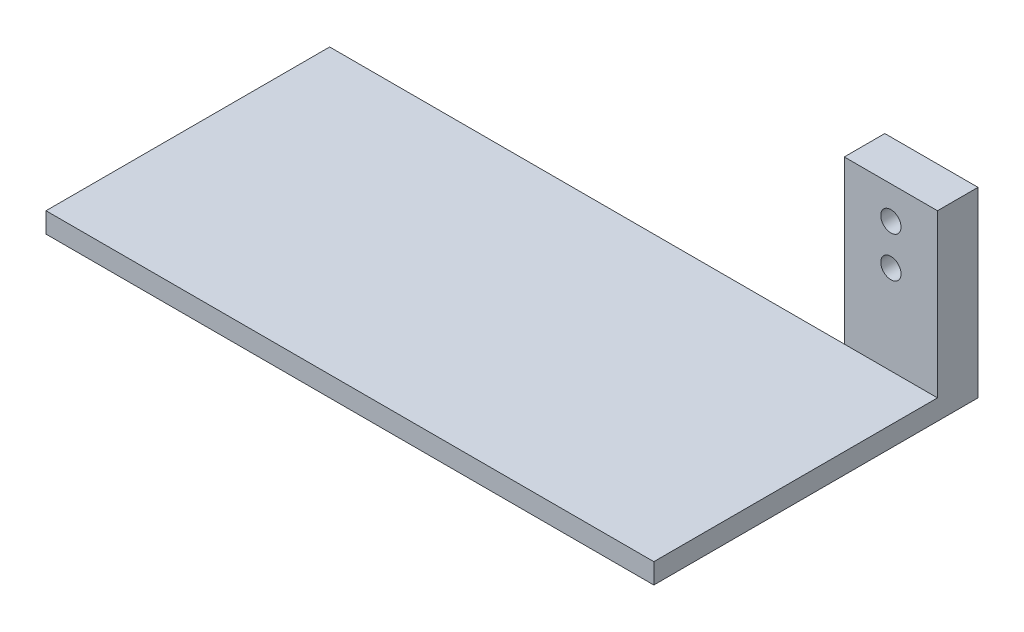
ISO-10303-21;
HEADER;
FILE_DESCRIPTION(('STEP AP214'),'2;1');
FILE_NAME('part.step','',(''),(''),'','','');
FILE_SCHEMA(('AUTOMOTIVE_DESIGN { 1 0 10303 214 1 1 1 1 }'));
ENDSEC;
DATA;
#1=APPLICATION_CONTEXT('core data for automotive mechanical design processes');
#2=APPLICATION_PROTOCOL_DEFINITION('international standard','automotive_design',2000,#1);
#3=PRODUCT_CONTEXT('',#1,'mechanical');
#4=PRODUCT('Part','Part','',(#3));
#5=PRODUCT_RELATED_PRODUCT_CATEGORY('part','',(#4));
#6=PRODUCT_DEFINITION_FORMATION('','',#4);
#7=PRODUCT_DEFINITION_CONTEXT('part definition',#1,'design');
#8=PRODUCT_DEFINITION('design','',#6,#7);
#9=PRODUCT_DEFINITION_SHAPE('','',#8);
#10=(LENGTH_UNIT() NAMED_UNIT(*) SI_UNIT(.MILLI.,.METRE.));
#11=(NAMED_UNIT(*) PLANE_ANGLE_UNIT() SI_UNIT($,.RADIAN.));
#12=(NAMED_UNIT(*) SI_UNIT($,.STERADIAN.) SOLID_ANGLE_UNIT());
#13=UNCERTAINTY_MEASURE_WITH_UNIT(LENGTH_MEASURE(1.E-05),#10,'distance_accuracy_value','');
#14=(GEOMETRIC_REPRESENTATION_CONTEXT(3) GLOBAL_UNCERTAINTY_ASSIGNED_CONTEXT((#13)) GLOBAL_UNIT_ASSIGNED_CONTEXT((#10,
#11,#12)) REPRESENTATION_CONTEXT('',''));
#15=CARTESIAN_POINT('',(0.,0.,0.));
#16=DIRECTION('',(0.,0.,1.));
#17=DIRECTION('',(1.,0.,0.));
#18=AXIS2_PLACEMENT_3D('',#15,#16,#17);
#19=CARTESIAN_POINT('',(-11.5,40.,5.));
#20=DIRECTION('',(0.,0.,-1.));
#21=DIRECTION('',(-1.,0.,0.));
#22=AXIS2_PLACEMENT_3D('',#19,#20,#21);
#23=PLANE('',#22);
#24=CARTESIAN_POINT('',(0.,22.,5.));
#25=DIRECTION('',(0.,0.,1.));
#26=DIRECTION('',(1.,0.,0.));
#27=AXIS2_PLACEMENT_3D('',#24,#25,#26);
#28=CIRCLE('',#27,2.5);
#29=CARTESIAN_POINT('',(2.5,22.,5.));
#30=VERTEX_POINT('',#29);
#31=EDGE_CURVE('E130',#30,#30,#28,.T.);
#32=ORIENTED_EDGE('',*,*,#31,.F.);
#33=EDGE_LOOP('',(#32));
#34=FACE_BOUND('',#33,.T.);
#35=CARTESIAN_POINT('',(0.,32.,5.));
#36=DIRECTION('',(0.,0.,1.));
#37=DIRECTION('',(1.,0.,0.));
#38=AXIS2_PLACEMENT_3D('',#35,#36,#37);
#39=CIRCLE('',#38,2.5);
#40=CARTESIAN_POINT('',(2.5,32.,5.));
#41=VERTEX_POINT('',#40);
#42=EDGE_CURVE('E135',#41,#41,#39,.T.);
#43=ORIENTED_EDGE('',*,*,#42,.F.);
#44=EDGE_LOOP('',(#43));
#45=FACE_BOUND('',#44,.T.);
#46=DIRECTION('',(-1.,0.,0.));
#47=VECTOR('',#46,1.);
#48=CARTESIAN_POINT('',(-138.5,0.,5.));
#49=LINE('',#48,#47);
#50=CARTESIAN_POINT('',(11.5,0.,5.));
#51=VERTEX_POINT('',#50);
#52=CARTESIAN_POINT('',(-11.5,0.,5.));
#53=VERTEX_POINT('',#52);
#54=EDGE_CURVE('E47',#51,#53,#49,.T.);
#55=ORIENTED_EDGE('',*,*,#54,.F.);
#56=DIRECTION('',(0.,-1.,0.));
#57=VECTOR('',#56,1.);
#58=CARTESIAN_POINT('',(11.5,40.,5.));
#59=LINE('',#58,#57);
#60=CARTESIAN_POINT('',(11.5,40.,5.));
#61=VERTEX_POINT('',#60);
#62=EDGE_CURVE('E116',#61,#51,#59,.T.);
#63=ORIENTED_EDGE('',*,*,#62,.F.);
#64=DIRECTION('',(1.,0.,0.));
#65=VECTOR('',#64,1.);
#66=CARTESIAN_POINT('',(-11.5,40.,5.));
#67=LINE('',#66,#65);
#68=CARTESIAN_POINT('',(-11.5,40.,5.));
#69=VERTEX_POINT('',#68);
#70=EDGE_CURVE('E55',#69,#61,#67,.T.);
#71=ORIENTED_EDGE('',*,*,#70,.F.);
#72=DIRECTION('',(0.,-1.,0.));
#73=VECTOR('',#72,1.);
#74=CARTESIAN_POINT('',(-11.5,40.,5.));
#75=LINE('',#74,#73);
#76=EDGE_CURVE('E151',#69,#53,#75,.T.);
#77=ORIENTED_EDGE('',*,*,#76,.T.);
#78=EDGE_LOOP('',(#55,#63,#71,#77));
#79=FACE_BOUND('',#78,.T.);
#80=ADVANCED_FACE('F32',(#34,#45,#79),#23,.F.);
#81=CARTESIAN_POINT('',(11.5,40.,-5.));
#82=DIRECTION('',(-1.,0.,0.));
#83=DIRECTION('',(0.,0.,1.));
#84=AXIS2_PLACEMENT_3D('',#81,#82,#83);
#85=PLANE('',#84);
#86=ORIENTED_EDGE('',*,*,#62,.T.);
#87=DIRECTION('',(0.,0.,-1.));
#88=VECTOR('',#87,1.);
#89=CARTESIAN_POINT('',(11.5,0.,75.));
#90=LINE('',#89,#88);
#91=CARTESIAN_POINT('',(11.5,0.,75.));
#92=VERTEX_POINT('',#91);
#93=EDGE_CURVE('E98',#92,#51,#90,.T.);
#94=ORIENTED_EDGE('',*,*,#93,.F.);
#95=DIRECTION('',(0.,1.,0.));
#96=VECTOR('',#95,1.);
#97=CARTESIAN_POINT('',(11.5,0.,75.));
#98=LINE('',#97,#96);
#99=CARTESIAN_POINT('',(11.5,-5.,75.));
#100=VERTEX_POINT('',#99);
#101=EDGE_CURVE('E104',#100,#92,#98,.T.);
#102=ORIENTED_EDGE('',*,*,#101,.F.);
#103=DIRECTION('',(0.,0.,1.));
#104=VECTOR('',#103,1.);
#105=CARTESIAN_POINT('',(11.5,-5.,-5.));
#106=LINE('',#105,#104);
#107=CARTESIAN_POINT('',(11.5,-5.,-5.));
#108=VERTEX_POINT('',#107);
#109=EDGE_CURVE('E120',#108,#100,#106,.T.);
#110=ORIENTED_EDGE('',*,*,#109,.F.);
#111=DIRECTION('',(0.,-1.,0.));
#112=VECTOR('',#111,1.);
#113=CARTESIAN_POINT('',(11.5,40.,-5.));
#114=LINE('',#113,#112);
#115=CARTESIAN_POINT('',(11.5,40.,-5.));
#116=VERTEX_POINT('',#115);
#117=EDGE_CURVE('E11',#116,#108,#114,.T.);
#118=ORIENTED_EDGE('',*,*,#117,.F.);
#119=DIRECTION('',(0.,0.,-1.));
#120=VECTOR('',#119,1.);
#121=CARTESIAN_POINT('',(11.5,40.,-5.));
#122=LINE('',#121,#120);
#123=EDGE_CURVE('E134',#61,#116,#122,.T.);
#124=ORIENTED_EDGE('',*,*,#123,.F.);
#125=EDGE_LOOP('',(#86,#94,#102,#110,#118,#124));
#126=FACE_BOUND('',#125,.T.);
#127=ADVANCED_FACE('F34',(#126),#85,.F.);
#128=CARTESIAN_POINT('',(-11.5,40.,-5.));
#129=DIRECTION('',(0.,0.,1.));
#130=DIRECTION('',(1.,0.,0.));
#131=AXIS2_PLACEMENT_3D('',#128,#129,#130);
#132=PLANE('',#131);
#133=CARTESIAN_POINT('',(0.,32.,-5.));
#134=DIRECTION('',(0.,0.,1.));
#135=DIRECTION('',(1.,0.,0.));
#136=AXIS2_PLACEMENT_3D('',#133,#134,#135);
#137=CIRCLE('',#136,2.5);
#138=CARTESIAN_POINT('',(2.5,32.,-5.));
#139=VERTEX_POINT('',#138);
#140=EDGE_CURVE('E131',#139,#139,#137,.T.);
#141=ORIENTED_EDGE('',*,*,#140,.T.);
#142=EDGE_LOOP('',(#141));
#143=FACE_BOUND('',#142,.T.);
#144=CARTESIAN_POINT('',(0.,22.,-5.));
#145=DIRECTION('',(0.,0.,1.));
#146=DIRECTION('',(1.,0.,0.));
#147=AXIS2_PLACEMENT_3D('',#144,#145,#146);
#148=CIRCLE('',#147,2.5);
#149=CARTESIAN_POINT('',(2.5,22.,-5.));
#150=VERTEX_POINT('',#149);
#151=EDGE_CURVE('E138',#150,#150,#148,.T.);
#152=ORIENTED_EDGE('',*,*,#151,.T.);
#153=EDGE_LOOP('',(#152));
#154=FACE_BOUND('',#153,.T.);
#155=ORIENTED_EDGE('',*,*,#117,.T.);
#156=DIRECTION('',(1.,0.,0.));
#157=VECTOR('',#156,1.);
#158=CARTESIAN_POINT('',(-11.5,-5.,-5.));
#159=LINE('',#158,#157);
#160=CARTESIAN_POINT('',(-11.5,-5.,-5.));
#161=VERTEX_POINT('',#160);
#162=EDGE_CURVE('E117',#161,#108,#159,.T.);
#163=ORIENTED_EDGE('',*,*,#162,.F.);
#164=DIRECTION('',(0.,-1.,0.));
#165=VECTOR('',#164,1.);
#166=CARTESIAN_POINT('',(-11.5,40.,-5.));
#167=LINE('',#166,#165);
#168=CARTESIAN_POINT('',(-11.5,40.,-5.));
#169=VERTEX_POINT('',#168);
#170=EDGE_CURVE('E40',#169,#161,#167,.T.);
#171=ORIENTED_EDGE('',*,*,#170,.F.);
#172=DIRECTION('',(-1.,0.,0.));
#173=VECTOR('',#172,1.);
#174=CARTESIAN_POINT('',(-11.5,40.,-5.));
#175=LINE('',#174,#173);
#176=EDGE_CURVE('E144',#116,#169,#175,.T.);
#177=ORIENTED_EDGE('',*,*,#176,.F.);
#178=EDGE_LOOP('',(#155,#163,#171,#177));
#179=FACE_BOUND('',#178,.T.);
#180=ADVANCED_FACE('F166',(#143,#154,#179),#132,.F.);
#181=CARTESIAN_POINT('',(-11.5,40.,-5.));
#182=DIRECTION('',(1.,0.,0.));
#183=DIRECTION('',(0.,0.,-1.));
#184=AXIS2_PLACEMENT_3D('',#181,#182,#183);
#185=PLANE('',#184);
#186=ORIENTED_EDGE('',*,*,#170,.T.);
#187=DIRECTION('',(0.,0.,-1.));
#188=VECTOR('',#187,1.);
#189=CARTESIAN_POINT('',(-11.5,-5.,5.));
#190=LINE('',#189,#188);
#191=CARTESIAN_POINT('',(-11.5,-5.,5.));
#192=VERTEX_POINT('',#191);
#193=EDGE_CURVE('E127',#192,#161,#190,.T.);
#194=ORIENTED_EDGE('',*,*,#193,.F.);
#195=EDGE_CURVE('E150',#53,#192,#75,.T.);
#196=ORIENTED_EDGE('',*,*,#195,.F.);
#197=ORIENTED_EDGE('',*,*,#76,.F.);
#198=DIRECTION('',(0.,0.,1.));
#199=VECTOR('',#198,1.);
#200=CARTESIAN_POINT('',(-11.5,40.,-5.));
#201=LINE('',#200,#199);
#202=EDGE_CURVE('E146',#169,#69,#201,.T.);
#203=ORIENTED_EDGE('',*,*,#202,.F.);
#204=EDGE_LOOP('',(#186,#194,#196,#197,#203));
#205=FACE_BOUND('',#204,.T.);
#206=ADVANCED_FACE('F155',(#205),#185,.F.);
#207=CARTESIAN_POINT('',(0.,40.,0.));
#208=DIRECTION('',(0.,1.,0.));
#209=DIRECTION('',(0.,0.,1.));
#210=AXIS2_PLACEMENT_3D('',#207,#208,#209);
#211=PLANE('',#210);
#212=ORIENTED_EDGE('',*,*,#123,.T.);
#213=ORIENTED_EDGE('',*,*,#176,.T.);
#214=ORIENTED_EDGE('',*,*,#202,.T.);
#215=ORIENTED_EDGE('',*,*,#70,.T.);
#216=EDGE_LOOP('',(#212,#213,#214,#215));
#217=FACE_BOUND('',#216,.T.);
#218=ADVANCED_FACE('F182',(#217),#211,.T.);
#219=CARTESIAN_POINT('',(0.,22.,-5.));
#220=DIRECTION('',(0.,0.,1.));
#221=DIRECTION('',(1.,0.,0.));
#222=AXIS2_PLACEMENT_3D('',#219,#220,#221);
#223=CYLINDRICAL_SURFACE('',#222,2.5);
#224=ORIENTED_EDGE('',*,*,#151,.F.);
#225=EDGE_LOOP('',(#224));
#226=FACE_BOUND('',#225,.T.);
#227=ORIENTED_EDGE('',*,*,#31,.T.);
#228=EDGE_LOOP('',(#227));
#229=FACE_BOUND('',#228,.T.);
#230=ADVANCED_FACE('F184',(#226,#229),#223,.F.);
#231=CARTESIAN_POINT('',(0.,32.,-5.));
#232=DIRECTION('',(0.,0.,1.));
#233=DIRECTION('',(1.,0.,0.));
#234=AXIS2_PLACEMENT_3D('',#231,#232,#233);
#235=CYLINDRICAL_SURFACE('',#234,2.5);
#236=ORIENTED_EDGE('',*,*,#140,.F.);
#237=EDGE_LOOP('',(#236));
#238=FACE_BOUND('',#237,.T.);
#239=ORIENTED_EDGE('',*,*,#42,.T.);
#240=EDGE_LOOP('',(#239));
#241=FACE_BOUND('',#240,.T.);
#242=ADVANCED_FACE('F190',(#238,#241),#235,.F.);
#243=CARTESIAN_POINT('',(0.,-5.,0.));
#244=DIRECTION('',(0.,-1.,0.));
#245=DIRECTION('',(0.,0.,-1.));
#246=AXIS2_PLACEMENT_3D('',#243,#244,#245);
#247=PLANE('',#246);
#248=ORIENTED_EDGE('',*,*,#162,.T.);
#249=ORIENTED_EDGE('',*,*,#109,.T.);
#250=DIRECTION('',(1.,0.,0.));
#251=VECTOR('',#250,1.);
#252=CARTESIAN_POINT('',(-138.5,-5.,75.));
#253=LINE('',#252,#251);
#254=CARTESIAN_POINT('',(-138.5,-5.,75.));
#255=VERTEX_POINT('',#254);
#256=EDGE_CURVE('E110',#255,#100,#253,.T.);
#257=ORIENTED_EDGE('',*,*,#256,.F.);
#258=DIRECTION('',(0.,0.,-1.));
#259=VECTOR('',#258,1.);
#260=CARTESIAN_POINT('',(-138.5,-5.,75.));
#261=LINE('',#260,#259);
#262=CARTESIAN_POINT('',(-138.5,-5.,5.));
#263=VERTEX_POINT('',#262);
#264=EDGE_CURVE('E122',#255,#263,#261,.T.);
#265=ORIENTED_EDGE('',*,*,#264,.T.);
#266=DIRECTION('',(1.,0.,0.));
#267=VECTOR('',#266,1.);
#268=CARTESIAN_POINT('',(-138.5,-5.,5.));
#269=LINE('',#268,#267);
#270=EDGE_CURVE('E113',#263,#192,#269,.T.);
#271=ORIENTED_EDGE('',*,*,#270,.T.);
#272=ORIENTED_EDGE('',*,*,#193,.T.);
#273=EDGE_LOOP('',(#248,#249,#257,#265,#271,#272));
#274=FACE_BOUND('',#273,.T.);
#275=ADVANCED_FACE('F163',(#274),#247,.T.);
#276=CARTESIAN_POINT('',(0.,0.,5.));
#277=DIRECTION('',(0.,0.,1.));
#278=DIRECTION('',(1.,0.,0.));
#279=AXIS2_PLACEMENT_3D('',#276,#277,#278);
#280=PLANE('',#279);
#281=CARTESIAN_POINT('',(-138.5,0.,5.));
#282=VERTEX_POINT('',#281);
#283=EDGE_CURVE('E174',#53,#282,#49,.T.);
#284=ORIENTED_EDGE('',*,*,#283,.F.);
#285=ORIENTED_EDGE('',*,*,#195,.T.);
#286=ORIENTED_EDGE('',*,*,#270,.F.);
#287=DIRECTION('',(0.,-1.,0.));
#288=VECTOR('',#287,1.);
#289=CARTESIAN_POINT('',(-138.5,0.,5.));
#290=LINE('',#289,#288);
#291=EDGE_CURVE('E173',#282,#263,#290,.T.);
#292=ORIENTED_EDGE('',*,*,#291,.F.);
#293=EDGE_LOOP('',(#284,#285,#286,#292));
#294=FACE_BOUND('',#293,.T.);
#295=ADVANCED_FACE('F181',(#294),#280,.F.);
#296=CARTESIAN_POINT('',(-138.5,0.,75.));
#297=DIRECTION('',(0.,-1.,0.));
#298=DIRECTION('',(0.,0.,-1.));
#299=AXIS2_PLACEMENT_3D('',#296,#297,#298);
#300=PLANE('',#299);
#301=ORIENTED_EDGE('',*,*,#54,.T.);
#302=ORIENTED_EDGE('',*,*,#283,.T.);
#303=DIRECTION('',(0.,0.,-1.));
#304=VECTOR('',#303,1.);
#305=CARTESIAN_POINT('',(-138.5,0.,75.));
#306=LINE('',#305,#304);
#307=CARTESIAN_POINT('',(-138.5,0.,75.));
#308=VERTEX_POINT('',#307);
#309=EDGE_CURVE('E100',#308,#282,#306,.T.);
#310=ORIENTED_EDGE('',*,*,#309,.F.);
#311=DIRECTION('',(-1.,0.,0.));
#312=VECTOR('',#311,1.);
#313=CARTESIAN_POINT('',(-138.5,0.,75.));
#314=LINE('',#313,#312);
#315=EDGE_CURVE('E94',#92,#308,#314,.T.);
#316=ORIENTED_EDGE('',*,*,#315,.F.);
#317=ORIENTED_EDGE('',*,*,#93,.T.);
#318=EDGE_LOOP('',(#301,#302,#310,#316,#317));
#319=FACE_BOUND('',#318,.T.);
#320=ADVANCED_FACE('F96',(#319),#300,.F.);
#321=CARTESIAN_POINT('',(-138.5,0.,75.));
#322=DIRECTION('',(1.,0.,0.));
#323=DIRECTION('',(0.,0.,-1.));
#324=AXIS2_PLACEMENT_3D('',#321,#322,#323);
#325=PLANE('',#324);
#326=ORIENTED_EDGE('',*,*,#291,.T.);
#327=ORIENTED_EDGE('',*,*,#264,.F.);
#328=DIRECTION('',(0.,-1.,0.));
#329=VECTOR('',#328,1.);
#330=CARTESIAN_POINT('',(-138.5,0.,75.));
#331=LINE('',#330,#329);
#332=EDGE_CURVE('E103',#308,#255,#331,.T.);
#333=ORIENTED_EDGE('',*,*,#332,.F.);
#334=ORIENTED_EDGE('',*,*,#309,.T.);
#335=EDGE_LOOP('',(#326,#327,#333,#334));
#336=FACE_BOUND('',#335,.T.);
#337=ADVANCED_FACE('F178',(#336),#325,.F.);
#338=CARTESIAN_POINT('',(0.,0.,75.));
#339=DIRECTION('',(0.,0.,1.));
#340=DIRECTION('',(1.,0.,0.));
#341=AXIS2_PLACEMENT_3D('',#338,#339,#340);
#342=PLANE('',#341);
#343=ORIENTED_EDGE('',*,*,#101,.T.);
#344=ORIENTED_EDGE('',*,*,#315,.T.);
#345=ORIENTED_EDGE('',*,*,#332,.T.);
#346=ORIENTED_EDGE('',*,*,#256,.T.);
#347=EDGE_LOOP('',(#343,#344,#345,#346));
#348=FACE_BOUND('',#347,.T.);
#349=ADVANCED_FACE('F108',(#348),#342,.T.);
#350=CLOSED_SHELL('',(#80,#127,#180,#206,#218,#230,#242,#275,#295,#320,#337,#349));
#351=MANIFOLD_SOLID_BREP('B2',#350);
#352=ADVANCED_BREP_SHAPE_REPRESENTATION('',(#18,#351),#14);
#353=SHAPE_DEFINITION_REPRESENTATION(#9,#352);
ENDSEC;
END-ISO-10303-21;
